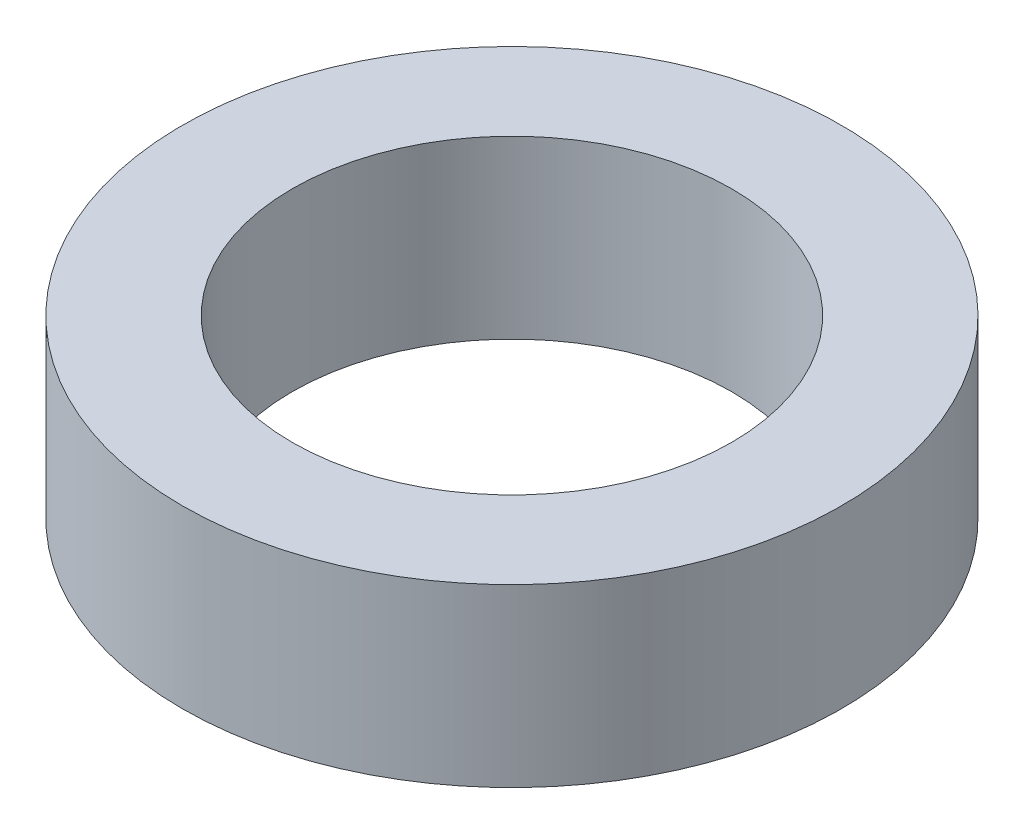
ISO-10303-21;
HEADER;
FILE_DESCRIPTION(('STEP AP214'),'2;1');
FILE_NAME('part.step','',(''),(''),'','','');
FILE_SCHEMA(('AUTOMOTIVE_DESIGN { 1 0 10303 214 1 1 1 1 }'));
ENDSEC;
DATA;
#1=APPLICATION_CONTEXT('core data for automotive mechanical design processes');
#2=APPLICATION_PROTOCOL_DEFINITION('international standard','automotive_design',2000,#1);
#3=PRODUCT_CONTEXT('',#1,'mechanical');
#4=PRODUCT('Part','Part','',(#3));
#5=PRODUCT_RELATED_PRODUCT_CATEGORY('part','',(#4));
#6=PRODUCT_DEFINITION_FORMATION('','',#4);
#7=PRODUCT_DEFINITION_CONTEXT('part definition',#1,'design');
#8=PRODUCT_DEFINITION('design','',#6,#7);
#9=PRODUCT_DEFINITION_SHAPE('','',#8);
#10=(LENGTH_UNIT() NAMED_UNIT(*) SI_UNIT(.MILLI.,.METRE.));
#11=(NAMED_UNIT(*) PLANE_ANGLE_UNIT() SI_UNIT($,.RADIAN.));
#12=(NAMED_UNIT(*) SI_UNIT($,.STERADIAN.) SOLID_ANGLE_UNIT());
#13=UNCERTAINTY_MEASURE_WITH_UNIT(LENGTH_MEASURE(1.E-05),#10,'distance_accuracy_value','');
#14=(GEOMETRIC_REPRESENTATION_CONTEXT(3) GLOBAL_UNCERTAINTY_ASSIGNED_CONTEXT((#13)) GLOBAL_UNIT_ASSIGNED_CONTEXT((#10,
#11,#12)) REPRESENTATION_CONTEXT('',''));
#15=CARTESIAN_POINT('',(0.,0.,0.));
#16=DIRECTION('',(0.,0.,1.));
#17=DIRECTION('',(1.,0.,0.));
#18=AXIS2_PLACEMENT_3D('',#15,#16,#17);
#19=CARTESIAN_POINT('',(0.,4.,0.));
#20=DIRECTION('',(0.,1.,0.));
#21=DIRECTION('',(0.,0.,1.));
#22=AXIS2_PLACEMENT_3D('',#19,#20,#21);
#23=PLANE('',#22);
#24=CARTESIAN_POINT('',(0.,4.,0.));
#25=DIRECTION('',(0.,1.,0.));
#26=DIRECTION('',(0.,0.,1.));
#27=AXIS2_PLACEMENT_3D('',#24,#25,#26);
#28=CIRCLE('',#27,7.5);
#29=CARTESIAN_POINT('',(0.,4.,7.5));
#30=VERTEX_POINT('',#29);
#31=EDGE_CURVE('E10',#30,#30,#28,.T.);
#32=ORIENTED_EDGE('',*,*,#31,.T.);
#33=EDGE_LOOP('',(#32));
#34=FACE_BOUND('',#33,.T.);
#35=CARTESIAN_POINT('',(0.,4.,0.));
#36=DIRECTION('',(0.,1.,0.));
#37=DIRECTION('',(0.,0.,1.));
#38=AXIS2_PLACEMENT_3D('',#35,#36,#37);
#39=CIRCLE('',#38,5.);
#40=CARTESIAN_POINT('',(0.,4.,5.));
#41=VERTEX_POINT('',#40);
#42=EDGE_CURVE('E42',#41,#41,#39,.T.);
#43=ORIENTED_EDGE('',*,*,#42,.F.);
#44=EDGE_LOOP('',(#43));
#45=FACE_BOUND('',#44,.T.);
#46=ADVANCED_FACE('F31',(#34,#45),#23,.T.);
#47=CARTESIAN_POINT('',(0.,0.,0.));
#48=DIRECTION('',(0.,1.,0.));
#49=DIRECTION('',(0.,0.,1.));
#50=AXIS2_PLACEMENT_3D('',#47,#48,#49);
#51=PLANE('',#50);
#52=CARTESIAN_POINT('',(0.,0.,0.));
#53=DIRECTION('',(0.,1.,0.));
#54=DIRECTION('',(0.,0.,1.));
#55=AXIS2_PLACEMENT_3D('',#52,#53,#54);
#56=CIRCLE('',#55,7.5);
#57=CARTESIAN_POINT('',(0.,0.,7.5));
#58=VERTEX_POINT('',#57);
#59=EDGE_CURVE('E35',#58,#58,#56,.T.);
#60=ORIENTED_EDGE('',*,*,#59,.F.);
#61=EDGE_LOOP('',(#60));
#62=FACE_BOUND('',#61,.T.);
#63=CARTESIAN_POINT('',(0.,0.,0.));
#64=DIRECTION('',(0.,1.,0.));
#65=DIRECTION('',(0.,0.,1.));
#66=AXIS2_PLACEMENT_3D('',#63,#64,#65);
#67=CIRCLE('',#66,5.);
#68=CARTESIAN_POINT('',(0.,0.,5.));
#69=VERTEX_POINT('',#68);
#70=EDGE_CURVE('E44',#69,#69,#67,.T.);
#71=ORIENTED_EDGE('',*,*,#70,.T.);
#72=EDGE_LOOP('',(#71));
#73=FACE_BOUND('',#72,.T.);
#74=ADVANCED_FACE('F54',(#62,#73),#51,.F.);
#75=CARTESIAN_POINT('',(0.,4.,0.));
#76=DIRECTION('',(0.,-1.,0.));
#77=DIRECTION('',(0.,0.,-1.));
#78=AXIS2_PLACEMENT_3D('',#75,#76,#77);
#79=CYLINDRICAL_SURFACE('',#78,7.5);
#80=ORIENTED_EDGE('',*,*,#31,.F.);
#81=EDGE_LOOP('',(#80));
#82=FACE_BOUND('',#81,.T.);
#83=ORIENTED_EDGE('',*,*,#59,.T.);
#84=EDGE_LOOP('',(#83));
#85=FACE_BOUND('',#84,.T.);
#86=ADVANCED_FACE('F33',(#82,#85),#79,.T.);
#87=CARTESIAN_POINT('',(0.,4.,0.));
#88=DIRECTION('',(0.,-1.,0.));
#89=DIRECTION('',(0.,0.,-1.));
#90=AXIS2_PLACEMENT_3D('',#87,#88,#89);
#91=CYLINDRICAL_SURFACE('',#90,5.);
#92=ORIENTED_EDGE('',*,*,#42,.T.);
#93=EDGE_LOOP('',(#92));
#94=FACE_BOUND('',#93,.T.);
#95=ORIENTED_EDGE('',*,*,#70,.F.);
#96=EDGE_LOOP('',(#95));
#97=FACE_BOUND('',#96,.T.);
#98=ADVANCED_FACE('F50',(#94,#97),#91,.F.);
#99=CLOSED_SHELL('',(#46,#74,#86,#98));
#100=MANIFOLD_SOLID_BREP('B2',#99);
#101=ADVANCED_BREP_SHAPE_REPRESENTATION('',(#18,#100),#14);
#102=SHAPE_DEFINITION_REPRESENTATION(#9,#101);
ENDSEC;
END-ISO-10303-21;
